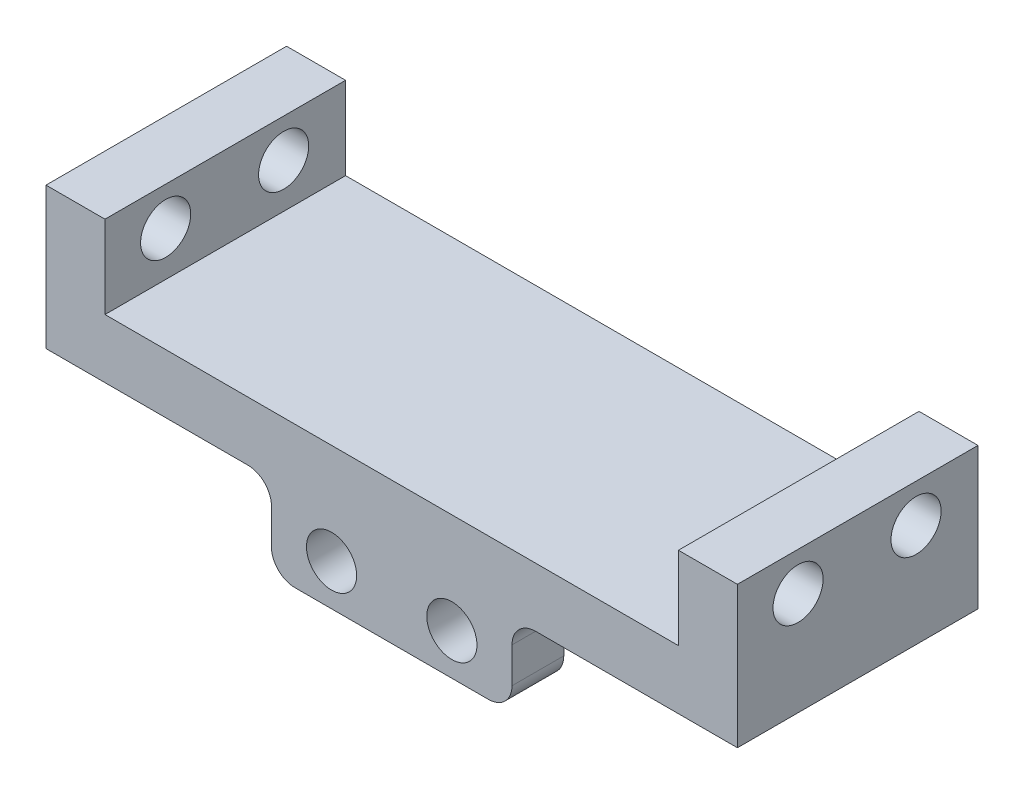
ISO-10303-21;
HEADER;
FILE_DESCRIPTION(('STEP AP214'),'2;1');
FILE_NAME('part.step','',(''),(''),'','','');
FILE_SCHEMA(('AUTOMOTIVE_DESIGN { 1 0 10303 214 1 1 1 1 }'));
ENDSEC;
DATA;
#1=APPLICATION_CONTEXT('core data for automotive mechanical design processes');
#2=APPLICATION_PROTOCOL_DEFINITION('international standard','automotive_design',2000,#1);
#3=PRODUCT_CONTEXT('',#1,'mechanical');
#4=PRODUCT('Part','Part','',(#3));
#5=PRODUCT_RELATED_PRODUCT_CATEGORY('part','',(#4));
#6=PRODUCT_DEFINITION_FORMATION('','',#4);
#7=PRODUCT_DEFINITION_CONTEXT('part definition',#1,'design');
#8=PRODUCT_DEFINITION('design','',#6,#7);
#9=PRODUCT_DEFINITION_SHAPE('','',#8);
#10=(LENGTH_UNIT() NAMED_UNIT(*) SI_UNIT(.MILLI.,.METRE.));
#11=(NAMED_UNIT(*) PLANE_ANGLE_UNIT() SI_UNIT($,.RADIAN.));
#12=(NAMED_UNIT(*) SI_UNIT($,.STERADIAN.) SOLID_ANGLE_UNIT());
#13=UNCERTAINTY_MEASURE_WITH_UNIT(LENGTH_MEASURE(1.E-05),#10,'distance_accuracy_value','');
#14=(GEOMETRIC_REPRESENTATION_CONTEXT(3) GLOBAL_UNCERTAINTY_ASSIGNED_CONTEXT((#13)) GLOBAL_UNIT_ASSIGNED_CONTEXT((#10,
#11,#12)) REPRESENTATION_CONTEXT('',''));
#15=CARTESIAN_POINT('',(0.,0.,0.));
#16=DIRECTION('',(0.,0.,1.));
#17=DIRECTION('',(1.,0.,0.));
#18=AXIS2_PLACEMENT_3D('',#15,#16,#17);
#19=CARTESIAN_POINT('',(0.,5.,0.));
#20=DIRECTION('',(1.,0.,0.));
#21=DIRECTION('',(0.,0.,-1.));
#22=AXIS2_PLACEMENT_3D('',#19,#20,#21);
#23=PLANE('',#22);
#24=CARTESIAN_POINT('',(0.,8.75,-15.13979341));
#25=DIRECTION('',(1.,0.,0.));
#26=DIRECTION('',(0.,0.,-1.));
#27=AXIS2_PLACEMENT_3D('',#24,#25,#26);
#28=CIRCLE('',#27,2.125);
#29=CARTESIAN_POINT('',(0.,8.75,-17.26479341));
#30=VERTEX_POINT('',#29);
#31=EDGE_CURVE('E195',#30,#30,#28,.T.);
#32=ORIENTED_EDGE('',*,*,#31,.T.);
#33=EDGE_LOOP('',(#32));
#34=FACE_BOUND('',#33,.T.);
#35=CARTESIAN_POINT('',(0.,8.75,-5.13979341));
#36=DIRECTION('',(1.,0.,0.));
#37=DIRECTION('',(0.,0.,-1.));
#38=AXIS2_PLACEMENT_3D('',#35,#36,#37);
#39=CIRCLE('',#38,2.125);
#40=CARTESIAN_POINT('',(0.,8.75,-7.26479341));
#41=VERTEX_POINT('',#40);
#42=EDGE_CURVE('E204',#41,#41,#39,.T.);
#43=ORIENTED_EDGE('',*,*,#42,.T.);
#44=EDGE_LOOP('',(#43));
#45=FACE_BOUND('',#44,.T.);
#46=DIRECTION('',(0.,0.,1.));
#47=VECTOR('',#46,1.);
#48=CARTESIAN_POINT('',(0.,0.,0.));
#49=LINE('',#48,#47);
#50=CARTESIAN_POINT('',(0.,0.,-20.38979341));
#51=VERTEX_POINT('',#50);
#52=CARTESIAN_POINT('',(0.,0.,0.));
#53=VERTEX_POINT('',#52);
#54=EDGE_CURVE('E235',#51,#53,#49,.T.);
#55=ORIENTED_EDGE('',*,*,#54,.T.);
#56=DIRECTION('',(0.,-1.,0.));
#57=VECTOR('',#56,1.);
#58=CARTESIAN_POINT('',(0.,5.,0.));
#59=LINE('',#58,#57);
#60=CARTESIAN_POINT('',(0.,12.,0.));
#61=VERTEX_POINT('',#60);
#62=EDGE_CURVE('E266',#61,#53,#59,.T.);
#63=ORIENTED_EDGE('',*,*,#62,.F.);
#64=DIRECTION('',(0.,0.,-1.));
#65=VECTOR('',#64,1.);
#66=CARTESIAN_POINT('',(0.,12.,-20.38979341));
#67=LINE('',#66,#65);
#68=CARTESIAN_POINT('',(0.,12.,-20.38979341));
#69=VERTEX_POINT('',#68);
#70=EDGE_CURVE('E199',#61,#69,#67,.T.);
#71=ORIENTED_EDGE('',*,*,#70,.T.);
#72=DIRECTION('',(0.,-1.,0.));
#73=VECTOR('',#72,1.);
#74=CARTESIAN_POINT('',(0.,5.,-20.38979341));
#75=LINE('',#74,#73);
#76=EDGE_CURVE('E242',#69,#51,#75,.T.);
#77=ORIENTED_EDGE('',*,*,#76,.T.);
#78=EDGE_LOOP('',(#55,#63,#71,#77));
#79=FACE_BOUND('',#78,.T.);
#80=ADVANCED_FACE('F39',(#34,#45,#79),#23,.F.);
#81=CARTESIAN_POINT('',(0.,5.,0.));
#82=DIRECTION('',(0.,0.,-1.));
#83=DIRECTION('',(-1.,0.,0.));
#84=AXIS2_PLACEMENT_3D('',#81,#82,#83);
#85=PLANE('',#84);
#86=CARTESIAN_POINT('',(34.3974483525,-3.49999999999999,0.));
#87=DIRECTION('',(0.,0.,1.));
#88=DIRECTION('',(1.,0.,0.));
#89=AXIS2_PLACEMENT_3D('',#86,#87,#88);
#90=CIRCLE('',#89,2.125);
#91=CARTESIAN_POINT('',(36.5224483525,-3.49999999999999,0.));
#92=VERTEX_POINT('',#91);
#93=EDGE_CURVE('E276',#92,#92,#90,.T.);
#94=ORIENTED_EDGE('',*,*,#93,.F.);
#95=EDGE_LOOP('',(#94));
#96=FACE_BOUND('',#95,.T.);
#97=CARTESIAN_POINT('',(24.2025516475,-3.49999999999999,0.));
#98=DIRECTION('',(0.,0.,1.));
#99=DIRECTION('',(-1.,0.,0.));
#100=AXIS2_PLACEMENT_3D('',#97,#98,#99);
#101=CIRCLE('',#100,2.125);
#102=CARTESIAN_POINT('',(22.0775516475,-3.49999999999999,0.));
#103=VERTEX_POINT('',#102);
#104=EDGE_CURVE('E429',#103,#103,#101,.T.);
#105=ORIENTED_EDGE('',*,*,#104,.F.);
#106=EDGE_LOOP('',(#105));
#107=FACE_BOUND('',#106,.T.);
#108=DIRECTION('',(0.,-1.,0.));
#109=VECTOR('',#108,1.);
#110=CARTESIAN_POINT('',(19.105103295,0.,0.));
#111=LINE('',#110,#109);
#112=CARTESIAN_POINT('',(19.105103295,-2.,0.));
#113=VERTEX_POINT('',#112);
#114=CARTESIAN_POINT('',(19.105103295,-5.,0.));
#115=VERTEX_POINT('',#114);
#116=EDGE_CURVE('E329',#113,#115,#111,.T.);
#117=ORIENTED_EDGE('',*,*,#116,.T.);
#118=CARTESIAN_POINT('',(21.105103295,-5.,0.));
#119=DIRECTION('',(0.,0.,-1.));
#120=DIRECTION('',(-1.,0.,0.));
#121=AXIS2_PLACEMENT_3D('',#118,#119,#120);
#122=CIRCLE('',#121,2.);
#123=CARTESIAN_POINT('',(21.105103295,-7.,0.));
#124=VERTEX_POINT('',#123);
#125=EDGE_CURVE('E290',#115,#124,#122,.F.);
#126=ORIENTED_EDGE('',*,*,#125,.T.);
#127=DIRECTION('',(1.,0.,0.));
#128=VECTOR('',#127,1.);
#129=CARTESIAN_POINT('',(39.494896705,-6.99999999999999,0.));
#130=LINE('',#129,#128);
#131=CARTESIAN_POINT('',(37.494896705,-6.99999999999999,0.));
#132=VERTEX_POINT('',#131);
#133=EDGE_CURVE('E339',#124,#132,#130,.T.);
#134=ORIENTED_EDGE('',*,*,#133,.T.);
#135=CARTESIAN_POINT('',(37.494896705,-4.99999999999999,0.));
#136=DIRECTION('',(0.,0.,-1.));
#137=DIRECTION('',(-1.,0.,0.));
#138=AXIS2_PLACEMENT_3D('',#135,#136,#137);
#139=CIRCLE('',#138,2.);
#140=CARTESIAN_POINT('',(39.494896705,-4.99999999999999,0.));
#141=VERTEX_POINT('',#140);
#142=EDGE_CURVE('E287',#132,#141,#139,.F.);
#143=ORIENTED_EDGE('',*,*,#142,.T.);
#144=DIRECTION('',(0.,1.,0.));
#145=VECTOR('',#144,1.);
#146=CARTESIAN_POINT('',(39.494896705,0.,0.));
#147=LINE('',#146,#145);
#148=CARTESIAN_POINT('',(39.494896705,-2.,0.));
#149=VERTEX_POINT('',#148);
#150=EDGE_CURVE('E280',#141,#149,#147,.T.);
#151=ORIENTED_EDGE('',*,*,#150,.T.);
#152=CARTESIAN_POINT('',(41.494896705,-2.,0.));
#153=DIRECTION('',(0.,0.,-1.));
#154=DIRECTION('',(-1.,0.,0.));
#155=AXIS2_PLACEMENT_3D('',#152,#153,#154);
#156=CIRCLE('',#155,2.);
#157=CARTESIAN_POINT('',(41.494896705,0.,0.));
#158=VERTEX_POINT('',#157);
#159=EDGE_CURVE('E319',#149,#158,#156,.T.);
#160=ORIENTED_EDGE('',*,*,#159,.T.);
#161=DIRECTION('',(1.,0.,0.));
#162=VECTOR('',#161,1.);
#163=CARTESIAN_POINT('',(0.,0.,0.));
#164=LINE('',#163,#162);
#165=CARTESIAN_POINT('',(58.6,0.,0.));
#166=VERTEX_POINT('',#165);
#167=EDGE_CURVE('E246',#158,#166,#164,.T.);
#168=ORIENTED_EDGE('',*,*,#167,.T.);
#169=DIRECTION('',(0.,-1.,0.));
#170=VECTOR('',#169,1.);
#171=CARTESIAN_POINT('',(58.6,5.,0.));
#172=LINE('',#171,#170);
#173=CARTESIAN_POINT('',(58.6,12.,0.));
#174=VERTEX_POINT('',#173);
#175=EDGE_CURVE('E262',#174,#166,#172,.T.);
#176=ORIENTED_EDGE('',*,*,#175,.F.);
#177=DIRECTION('',(1.,0.,0.));
#178=VECTOR('',#177,1.);
#179=CARTESIAN_POINT('',(53.6,12.,0.));
#180=LINE('',#179,#178);
#181=CARTESIAN_POINT('',(53.6,12.,0.));
#182=VERTEX_POINT('',#181);
#183=EDGE_CURVE('E172',#182,#174,#180,.T.);
#184=ORIENTED_EDGE('',*,*,#183,.F.);
#185=DIRECTION('',(0.,1.,0.));
#186=VECTOR('',#185,1.);
#187=CARTESIAN_POINT('',(53.6,0.,0.));
#188=LINE('',#187,#186);
#189=CARTESIAN_POINT('',(53.6,5.,0.));
#190=VERTEX_POINT('',#189);
#191=EDGE_CURVE('E157',#190,#182,#188,.T.);
#192=ORIENTED_EDGE('',*,*,#191,.F.);
#193=DIRECTION('',(1.,0.,0.));
#194=VECTOR('',#193,1.);
#195=CARTESIAN_POINT('',(0.,5.,0.));
#196=LINE('',#195,#194);
#197=CARTESIAN_POINT('',(5.,5.,0.));
#198=VERTEX_POINT('',#197);
#199=EDGE_CURVE('E236',#198,#190,#196,.T.);
#200=ORIENTED_EDGE('',*,*,#199,.F.);
#201=DIRECTION('',(0.,1.,0.));
#202=VECTOR('',#201,1.);
#203=CARTESIAN_POINT('',(5.,0.,0.));
#204=LINE('',#203,#202);
#205=CARTESIAN_POINT('',(5.,12.,0.));
#206=VERTEX_POINT('',#205);
#207=EDGE_CURVE('E214',#198,#206,#204,.T.);
#208=ORIENTED_EDGE('',*,*,#207,.T.);
#209=DIRECTION('',(-1.,0.,0.));
#210=VECTOR('',#209,1.);
#211=CARTESIAN_POINT('',(5.,12.,0.));
#212=LINE('',#211,#210);
#213=EDGE_CURVE('E221',#206,#61,#212,.T.);
#214=ORIENTED_EDGE('',*,*,#213,.T.);
#215=ORIENTED_EDGE('',*,*,#62,.T.);
#216=CARTESIAN_POINT('',(17.105103295,0.,0.));
#217=VERTEX_POINT('',#216);
#218=EDGE_CURVE('E247',#53,#217,#164,.T.);
#219=ORIENTED_EDGE('',*,*,#218,.T.);
#220=CARTESIAN_POINT('',(17.105103295,-2.,0.));
#221=DIRECTION('',(0.,0.,-1.));
#222=DIRECTION('',(-1.,0.,0.));
#223=AXIS2_PLACEMENT_3D('',#220,#221,#222);
#224=CIRCLE('',#223,2.);
#225=EDGE_CURVE('E48',#217,#113,#224,.T.);
#226=ORIENTED_EDGE('',*,*,#225,.T.);
#227=EDGE_LOOP('',(#117,#126,#134,#143,#151,#160,#168,#176,#184,#192,#200,#208,#214,#215,#219,#226));
#228=FACE_BOUND('',#227,.T.);
#229=ADVANCED_FACE('F328',(#96,#107,#228),#85,.F.);
#230=CARTESIAN_POINT('',(58.6,5.,0.));
#231=DIRECTION('',(-1.,0.,0.));
#232=DIRECTION('',(0.,0.,1.));
#233=AXIS2_PLACEMENT_3D('',#230,#231,#232);
#234=PLANE('',#233);
#235=CARTESIAN_POINT('',(58.6,8.75,-15.13979341));
#236=DIRECTION('',(1.,0.,0.));
#237=DIRECTION('',(0.,0.,-1.));
#238=AXIS2_PLACEMENT_3D('',#235,#236,#237);
#239=CIRCLE('',#238,2.125);
#240=CARTESIAN_POINT('',(58.6,8.75,-17.26479341));
#241=VERTEX_POINT('',#240);
#242=EDGE_CURVE('E181',#241,#241,#239,.T.);
#243=ORIENTED_EDGE('',*,*,#242,.F.);
#244=EDGE_LOOP('',(#243));
#245=FACE_BOUND('',#244,.T.);
#246=CARTESIAN_POINT('',(58.6,8.75,-5.13979341));
#247=DIRECTION('',(1.,0.,0.));
#248=DIRECTION('',(0.,0.,-1.));
#249=AXIS2_PLACEMENT_3D('',#246,#247,#248);
#250=CIRCLE('',#249,2.125);
#251=CARTESIAN_POINT('',(58.6,8.75,-7.26479341));
#252=VERTEX_POINT('',#251);
#253=EDGE_CURVE('E369',#252,#252,#250,.T.);
#254=ORIENTED_EDGE('',*,*,#253,.F.);
#255=EDGE_LOOP('',(#254));
#256=FACE_BOUND('',#255,.T.);
#257=DIRECTION('',(0.,0.,-1.));
#258=VECTOR('',#257,1.);
#259=CARTESIAN_POINT('',(58.6,0.,0.));
#260=LINE('',#259,#258);
#261=CARTESIAN_POINT('',(58.6,0.,-20.38979341));
#262=VERTEX_POINT('',#261);
#263=EDGE_CURVE('E251',#166,#262,#260,.T.);
#264=ORIENTED_EDGE('',*,*,#263,.T.);
#265=DIRECTION('',(0.,-1.,0.));
#266=VECTOR('',#265,1.);
#267=CARTESIAN_POINT('',(58.6,5.,-20.38979341));
#268=LINE('',#267,#266);
#269=CARTESIAN_POINT('',(58.6,12.,-20.38979341));
#270=VERTEX_POINT('',#269);
#271=EDGE_CURVE('E259',#270,#262,#268,.T.);
#272=ORIENTED_EDGE('',*,*,#271,.F.);
#273=DIRECTION('',(0.,0.,-1.));
#274=VECTOR('',#273,1.);
#275=CARTESIAN_POINT('',(58.6,12.,-20.38979341));
#276=LINE('',#275,#274);
#277=EDGE_CURVE('E168',#174,#270,#276,.T.);
#278=ORIENTED_EDGE('',*,*,#277,.F.);
#279=ORIENTED_EDGE('',*,*,#175,.T.);
#280=EDGE_LOOP('',(#264,#272,#278,#279));
#281=FACE_BOUND('',#280,.T.);
#282=ADVANCED_FACE('F398',(#245,#256,#281),#234,.F.);
#283=CARTESIAN_POINT('',(0.,5.,-20.38979341));
#284=DIRECTION('',(0.,0.,1.));
#285=DIRECTION('',(1.,0.,0.));
#286=AXIS2_PLACEMENT_3D('',#283,#284,#285);
#287=PLANE('',#286);
#288=DIRECTION('',(-1.,0.,0.));
#289=VECTOR('',#288,1.);
#290=CARTESIAN_POINT('',(0.,5.,-20.38979341));
#291=LINE('',#290,#289);
#292=CARTESIAN_POINT('',(53.6,5.,-20.38979341));
#293=VERTEX_POINT('',#292);
#294=CARTESIAN_POINT('',(5.,5.,-20.38979341));
#295=VERTEX_POINT('',#294);
#296=EDGE_CURVE('E177',#293,#295,#291,.T.);
#297=ORIENTED_EDGE('',*,*,#296,.F.);
#298=DIRECTION('',(0.,-1.,0.));
#299=VECTOR('',#298,1.);
#300=CARTESIAN_POINT('',(53.6,0.,-20.38979341));
#301=LINE('',#300,#299);
#302=CARTESIAN_POINT('',(53.6,12.,-20.38979341));
#303=VERTEX_POINT('',#302);
#304=EDGE_CURVE('E155',#303,#293,#301,.T.);
#305=ORIENTED_EDGE('',*,*,#304,.F.);
#306=DIRECTION('',(1.,0.,0.));
#307=VECTOR('',#306,1.);
#308=CARTESIAN_POINT('',(53.6,12.,-20.38979341));
#309=LINE('',#308,#307);
#310=EDGE_CURVE('E165',#303,#270,#309,.T.);
#311=ORIENTED_EDGE('',*,*,#310,.T.);
#312=ORIENTED_EDGE('',*,*,#271,.T.);
#313=DIRECTION('',(-1.,0.,0.));
#314=VECTOR('',#313,1.);
#315=CARTESIAN_POINT('',(0.,0.,-20.38979341));
#316=LINE('',#315,#314);
#317=EDGE_CURVE('E239',#262,#51,#316,.T.);
#318=ORIENTED_EDGE('',*,*,#317,.T.);
#319=ORIENTED_EDGE('',*,*,#76,.F.);
#320=DIRECTION('',(-1.,0.,0.));
#321=VECTOR('',#320,1.);
#322=CARTESIAN_POINT('',(5.,12.,-20.38979341));
#323=LINE('',#322,#321);
#324=CARTESIAN_POINT('',(5.,12.,-20.38979341));
#325=VERTEX_POINT('',#324);
#326=EDGE_CURVE('E225',#325,#69,#323,.T.);
#327=ORIENTED_EDGE('',*,*,#326,.F.);
#328=DIRECTION('',(0.,-1.,0.));
#329=VECTOR('',#328,1.);
#330=CARTESIAN_POINT('',(5.,0.,-20.38979341));
#331=LINE('',#330,#329);
#332=EDGE_CURVE('E211',#325,#295,#331,.T.);
#333=ORIENTED_EDGE('',*,*,#332,.T.);
#334=EDGE_LOOP('',(#297,#305,#311,#312,#318,#319,#327,#333));
#335=FACE_BOUND('',#334,.T.);
#336=ADVANCED_FACE('F175',(#335),#287,.F.);
#337=CARTESIAN_POINT('',(0.,5.,0.));
#338=DIRECTION('',(0.,-1.,0.));
#339=DIRECTION('',(0.,0.,-1.));
#340=AXIS2_PLACEMENT_3D('',#337,#338,#339);
#341=PLANE('',#340);
#342=ORIENTED_EDGE('',*,*,#199,.T.);
#343=DIRECTION('',(0.,0.,-1.));
#344=VECTOR('',#343,1.);
#345=CARTESIAN_POINT('',(53.6,5.,0.));
#346=LINE('',#345,#344);
#347=EDGE_CURVE('E190',#190,#293,#346,.T.);
#348=ORIENTED_EDGE('',*,*,#347,.T.);
#349=ORIENTED_EDGE('',*,*,#296,.T.);
#350=DIRECTION('',(0.,0.,1.));
#351=VECTOR('',#350,1.);
#352=CARTESIAN_POINT('',(5.,5.,0.));
#353=LINE('',#352,#351);
#354=EDGE_CURVE('E229',#295,#198,#353,.T.);
#355=ORIENTED_EDGE('',*,*,#354,.T.);
#356=EDGE_LOOP('',(#342,#348,#349,#355));
#357=FACE_BOUND('',#356,.T.);
#358=ADVANCED_FACE('F525',(#357),#341,.F.);
#359=CARTESIAN_POINT('',(0.,0.,0.));
#360=DIRECTION('',(0.,-1.,0.));
#361=DIRECTION('',(0.,0.,-1.));
#362=AXIS2_PLACEMENT_3D('',#359,#360,#361);
#363=PLANE('',#362);
#364=ORIENTED_EDGE('',*,*,#167,.F.);
#365=DIRECTION('',(0.,0.,1.));
#366=VECTOR('',#365,1.);
#367=CARTESIAN_POINT('',(41.494896705,0.,-4.38979341));
#368=LINE('',#367,#366);
#369=CARTESIAN_POINT('',(41.494896705,0.,-4.38979341));
#370=VERTEX_POINT('',#369);
#371=EDGE_CURVE('E316',#158,#370,#368,.F.);
#372=ORIENTED_EDGE('',*,*,#371,.T.);
#373=DIRECTION('',(-1.,0.,0.));
#374=VECTOR('',#373,1.);
#375=CARTESIAN_POINT('',(39.494896705,0.,-4.38979341));
#376=LINE('',#375,#374);
#377=CARTESIAN_POINT('',(17.105103295,0.,-4.38979341));
#378=VERTEX_POINT('',#377);
#379=EDGE_CURVE('E54',#370,#378,#376,.T.);
#380=ORIENTED_EDGE('',*,*,#379,.T.);
#381=DIRECTION('',(0.,0.,1.));
#382=VECTOR('',#381,1.);
#383=CARTESIAN_POINT('',(17.105103295,0.,0.));
#384=LINE('',#383,#382);
#385=EDGE_CURVE('E313',#378,#217,#384,.T.);
#386=ORIENTED_EDGE('',*,*,#385,.T.);
#387=ORIENTED_EDGE('',*,*,#218,.F.);
#388=ORIENTED_EDGE('',*,*,#54,.F.);
#389=ORIENTED_EDGE('',*,*,#317,.F.);
#390=ORIENTED_EDGE('',*,*,#263,.F.);
#391=EDGE_LOOP('',(#364,#372,#380,#386,#387,#388,#389,#390));
#392=FACE_BOUND('',#391,.T.);
#393=ADVANCED_FACE('F520',(#392),#363,.T.);
#394=CARTESIAN_POINT('',(5.,0.,0.));
#395=DIRECTION('',(1.,0.,0.));
#396=DIRECTION('',(0.,0.,-1.));
#397=AXIS2_PLACEMENT_3D('',#394,#395,#396);
#398=PLANE('',#397);
#399=CARTESIAN_POINT('',(5.,8.75,-15.13979341));
#400=DIRECTION('',(1.,0.,0.));
#401=DIRECTION('',(0.,0.,-1.));
#402=AXIS2_PLACEMENT_3D('',#399,#400,#401);
#403=CIRCLE('',#402,2.125);
#404=CARTESIAN_POINT('',(5.,8.75,-17.26479341));
#405=VERTEX_POINT('',#404);
#406=EDGE_CURVE('E200',#405,#405,#403,.T.);
#407=ORIENTED_EDGE('',*,*,#406,.F.);
#408=EDGE_LOOP('',(#407));
#409=FACE_BOUND('',#408,.T.);
#410=CARTESIAN_POINT('',(5.,8.75,-5.13979341));
#411=DIRECTION('',(1.,0.,0.));
#412=DIRECTION('',(0.,0.,-1.));
#413=AXIS2_PLACEMENT_3D('',#410,#411,#412);
#414=CIRCLE('',#413,2.125);
#415=CARTESIAN_POINT('',(5.,8.75,-7.26479341));
#416=VERTEX_POINT('',#415);
#417=EDGE_CURVE('E194',#416,#416,#414,.T.);
#418=ORIENTED_EDGE('',*,*,#417,.F.);
#419=EDGE_LOOP('',(#418));
#420=FACE_BOUND('',#419,.T.);
#421=ORIENTED_EDGE('',*,*,#354,.F.);
#422=ORIENTED_EDGE('',*,*,#332,.F.);
#423=DIRECTION('',(0.,0.,-1.));
#424=VECTOR('',#423,1.);
#425=CARTESIAN_POINT('',(5.,12.,-20.38979341));
#426=LINE('',#425,#424);
#427=EDGE_CURVE('E217',#206,#325,#426,.T.);
#428=ORIENTED_EDGE('',*,*,#427,.F.);
#429=ORIENTED_EDGE('',*,*,#207,.F.);
#430=EDGE_LOOP('',(#421,#422,#428,#429));
#431=FACE_BOUND('',#430,.T.);
#432=ADVANCED_FACE('F524',(#409,#420,#431),#398,.T.);
#433=CARTESIAN_POINT('',(5.,12.,-20.38979341));
#434=DIRECTION('',(0.,1.,0.));
#435=DIRECTION('',(0.,0.,1.));
#436=AXIS2_PLACEMENT_3D('',#433,#434,#435);
#437=PLANE('',#436);
#438=ORIENTED_EDGE('',*,*,#70,.F.);
#439=ORIENTED_EDGE('',*,*,#213,.F.);
#440=ORIENTED_EDGE('',*,*,#427,.T.);
#441=ORIENTED_EDGE('',*,*,#326,.T.);
#442=EDGE_LOOP('',(#438,#439,#440,#441));
#443=FACE_BOUND('',#442,.T.);
#444=ADVANCED_FACE('F540',(#443),#437,.T.);
#445=CARTESIAN_POINT('',(0.,8.75,-5.13979341));
#446=DIRECTION('',(1.,0.,0.));
#447=DIRECTION('',(0.,0.,-1.));
#448=AXIS2_PLACEMENT_3D('',#445,#446,#447);
#449=CYLINDRICAL_SURFACE('',#448,2.125);
#450=ORIENTED_EDGE('',*,*,#42,.F.);
#451=EDGE_LOOP('',(#450));
#452=FACE_BOUND('',#451,.T.);
#453=ORIENTED_EDGE('',*,*,#417,.T.);
#454=EDGE_LOOP('',(#453));
#455=FACE_BOUND('',#454,.T.);
#456=ADVANCED_FACE('F549',(#452,#455),#449,.F.);
#457=CARTESIAN_POINT('',(0.,8.75,-15.13979341));
#458=DIRECTION('',(1.,0.,0.));
#459=DIRECTION('',(0.,0.,-1.));
#460=AXIS2_PLACEMENT_3D('',#457,#458,#459);
#461=CYLINDRICAL_SURFACE('',#460,2.125);
#462=ORIENTED_EDGE('',*,*,#31,.F.);
#463=EDGE_LOOP('',(#462));
#464=FACE_BOUND('',#463,.T.);
#465=ORIENTED_EDGE('',*,*,#406,.T.);
#466=EDGE_LOOP('',(#465));
#467=FACE_BOUND('',#466,.T.);
#468=ADVANCED_FACE('F556',(#464,#467),#461,.F.);
#469=CARTESIAN_POINT('',(53.6,0.,0.));
#470=DIRECTION('',(-1.,0.,0.));
#471=DIRECTION('',(0.,0.,-1.));
#472=AXIS2_PLACEMENT_3D('',#469,#470,#471);
#473=PLANE('',#472);
#474=CARTESIAN_POINT('',(53.6,8.75,-15.13979341));
#475=DIRECTION('',(1.,0.,0.));
#476=DIRECTION('',(0.,0.,-1.));
#477=AXIS2_PLACEMENT_3D('',#474,#475,#476);
#478=CIRCLE('',#477,2.125);
#479=CARTESIAN_POINT('',(53.6,8.75,-17.26479341));
#480=VERTEX_POINT('',#479);
#481=EDGE_CURVE('E366',#480,#480,#478,.T.);
#482=ORIENTED_EDGE('',*,*,#481,.T.);
#483=EDGE_LOOP('',(#482));
#484=FACE_BOUND('',#483,.T.);
#485=CARTESIAN_POINT('',(53.6,8.75,-5.13979341));
#486=DIRECTION('',(1.,0.,0.));
#487=DIRECTION('',(0.,0.,-1.));
#488=AXIS2_PLACEMENT_3D('',#485,#486,#487);
#489=CIRCLE('',#488,2.125);
#490=CARTESIAN_POINT('',(53.6,8.75,-7.26479341));
#491=VERTEX_POINT('',#490);
#492=EDGE_CURVE('E184',#491,#491,#489,.T.);
#493=ORIENTED_EDGE('',*,*,#492,.T.);
#494=EDGE_LOOP('',(#493));
#495=FACE_BOUND('',#494,.T.);
#496=ORIENTED_EDGE('',*,*,#347,.F.);
#497=ORIENTED_EDGE('',*,*,#191,.T.);
#498=DIRECTION('',(0.,0.,-1.));
#499=VECTOR('',#498,1.);
#500=CARTESIAN_POINT('',(53.6,12.,-20.38979341));
#501=LINE('',#500,#499);
#502=EDGE_CURVE('E150',#182,#303,#501,.T.);
#503=ORIENTED_EDGE('',*,*,#502,.T.);
#504=ORIENTED_EDGE('',*,*,#304,.T.);
#505=EDGE_LOOP('',(#496,#497,#503,#504));
#506=FACE_BOUND('',#505,.T.);
#507=ADVANCED_FACE('F153',(#484,#495,#506),#473,.T.);
#508=CARTESIAN_POINT('',(53.6,12.,-20.38979341));
#509=DIRECTION('',(0.,-1.,0.));
#510=DIRECTION('',(0.,0.,-1.));
#511=AXIS2_PLACEMENT_3D('',#508,#509,#510);
#512=PLANE('',#511);
#513=ORIENTED_EDGE('',*,*,#277,.T.);
#514=ORIENTED_EDGE('',*,*,#310,.F.);
#515=ORIENTED_EDGE('',*,*,#502,.F.);
#516=ORIENTED_EDGE('',*,*,#183,.T.);
#517=EDGE_LOOP('',(#513,#514,#515,#516));
#518=FACE_BOUND('',#517,.T.);
#519=ADVANCED_FACE('F166',(#518),#512,.F.);
#520=CARTESIAN_POINT('',(58.6,8.75,-5.13979341));
#521=DIRECTION('',(-1.,0.,0.));
#522=DIRECTION('',(0.,0.,1.));
#523=AXIS2_PLACEMENT_3D('',#520,#521,#522);
#524=CYLINDRICAL_SURFACE('',#523,2.125);
#525=ORIENTED_EDGE('',*,*,#253,.T.);
#526=EDGE_LOOP('',(#525));
#527=FACE_BOUND('',#526,.T.);
#528=ORIENTED_EDGE('',*,*,#492,.F.);
#529=EDGE_LOOP('',(#528));
#530=FACE_BOUND('',#529,.T.);
#531=ADVANCED_FACE('F379',(#527,#530),#524,.F.);
#532=CARTESIAN_POINT('',(58.6,8.75,-15.13979341));
#533=DIRECTION('',(-1.,0.,0.));
#534=DIRECTION('',(0.,0.,1.));
#535=AXIS2_PLACEMENT_3D('',#532,#533,#534);
#536=CYLINDRICAL_SURFACE('',#535,2.125);
#537=ORIENTED_EDGE('',*,*,#242,.T.);
#538=EDGE_LOOP('',(#537));
#539=FACE_BOUND('',#538,.T.);
#540=ORIENTED_EDGE('',*,*,#481,.F.);
#541=EDGE_LOOP('',(#540));
#542=FACE_BOUND('',#541,.T.);
#543=ADVANCED_FACE('F381',(#539,#542),#536,.F.);
#544=CARTESIAN_POINT('',(39.494896705,0.,-4.38979341));
#545=DIRECTION('',(1.,0.,0.));
#546=DIRECTION('',(0.,0.,-1.));
#547=AXIS2_PLACEMENT_3D('',#544,#545,#546);
#548=PLANE('',#547);
#549=ORIENTED_EDGE('',*,*,#150,.F.);
#550=DIRECTION('',(0.,0.,1.));
#551=VECTOR('',#550,1.);
#552=CARTESIAN_POINT('',(39.494896705,-4.99999999999999,-4.38979341));
#553=LINE('',#552,#551);
#554=CARTESIAN_POINT('',(39.494896705,-4.99999999999999,-4.38979341));
#555=VERTEX_POINT('',#554);
#556=EDGE_CURVE('E310',#141,#555,#553,.F.);
#557=ORIENTED_EDGE('',*,*,#556,.T.);
#558=DIRECTION('',(0.,1.,0.));
#559=VECTOR('',#558,1.);
#560=CARTESIAN_POINT('',(39.494896705,0.,-4.38979341));
#561=LINE('',#560,#559);
#562=CARTESIAN_POINT('',(39.494896705,-2.,-4.38979341));
#563=VERTEX_POINT('',#562);
#564=EDGE_CURVE('E353',#555,#563,#561,.T.);
#565=ORIENTED_EDGE('',*,*,#564,.T.);
#566=DIRECTION('',(0.,0.,1.));
#567=VECTOR('',#566,1.);
#568=CARTESIAN_POINT('',(39.494896705,-2.,0.));
#569=LINE('',#568,#567);
#570=EDGE_CURVE('E306',#563,#149,#569,.T.);
#571=ORIENTED_EDGE('',*,*,#570,.T.);
#572=EDGE_LOOP('',(#549,#557,#565,#571));
#573=FACE_BOUND('',#572,.T.);
#574=ADVANCED_FACE('F387',(#573),#548,.T.);
#575=CARTESIAN_POINT('',(39.494896705,-6.99999999999999,-4.38979341));
#576=DIRECTION('',(0.,-1.,0.));
#577=DIRECTION('',(1.,0.,0.));
#578=AXIS2_PLACEMENT_3D('',#575,#576,#577);
#579=PLANE('',#578);
#580=ORIENTED_EDGE('',*,*,#133,.F.);
#581=DIRECTION('',(0.,0.,1.));
#582=VECTOR('',#581,1.);
#583=CARTESIAN_POINT('',(21.105103295,-7.,-4.38979341));
#584=LINE('',#583,#582);
#585=CARTESIAN_POINT('',(21.105103295,-7.,-4.38979341));
#586=VERTEX_POINT('',#585);
#587=EDGE_CURVE('E297',#124,#586,#584,.F.);
#588=ORIENTED_EDGE('',*,*,#587,.T.);
#589=DIRECTION('',(1.,0.,0.));
#590=VECTOR('',#589,1.);
#591=CARTESIAN_POINT('',(39.494896705,-6.99999999999999,-4.38979341));
#592=LINE('',#591,#590);
#593=CARTESIAN_POINT('',(37.494896705,-6.99999999999999,-4.38979341));
#594=VERTEX_POINT('',#593);
#595=EDGE_CURVE('E347',#586,#594,#592,.T.);
#596=ORIENTED_EDGE('',*,*,#595,.T.);
#597=DIRECTION('',(0.,0.,1.));
#598=VECTOR('',#597,1.);
#599=CARTESIAN_POINT('',(37.494896705,-6.99999999999999,-4.38979341));
#600=LINE('',#599,#598);
#601=EDGE_CURVE('E293',#594,#132,#600,.T.);
#602=ORIENTED_EDGE('',*,*,#601,.T.);
#603=EDGE_LOOP('',(#580,#588,#596,#602));
#604=FACE_BOUND('',#603,.T.);
#605=ADVANCED_FACE('F453',(#604),#579,.T.);
#606=CARTESIAN_POINT('',(19.105103295,0.,-4.38979341));
#607=DIRECTION('',(-1.,0.,0.));
#608=DIRECTION('',(0.,-1.,0.));
#609=AXIS2_PLACEMENT_3D('',#606,#607,#608);
#610=PLANE('',#609);
#611=DIRECTION('',(0.,-1.,0.));
#612=VECTOR('',#611,1.);
#613=CARTESIAN_POINT('',(19.105103295,0.,-4.38979341));
#614=LINE('',#613,#612);
#615=CARTESIAN_POINT('',(19.105103295,-2.,-4.38979341));
#616=VERTEX_POINT('',#615);
#617=CARTESIAN_POINT('',(19.105103295,-5.,-4.38979341));
#618=VERTEX_POINT('',#617);
#619=EDGE_CURVE('E344',#616,#618,#614,.T.);
#620=ORIENTED_EDGE('',*,*,#619,.T.);
#621=DIRECTION('',(0.,0.,1.));
#622=VECTOR('',#621,1.);
#623=CARTESIAN_POINT('',(19.105103295,-5.,-4.38979341));
#624=LINE('',#623,#622);
#625=EDGE_CURVE('E283',#618,#115,#624,.T.);
#626=ORIENTED_EDGE('',*,*,#625,.T.);
#627=ORIENTED_EDGE('',*,*,#116,.F.);
#628=DIRECTION('',(0.,0.,1.));
#629=VECTOR('',#628,1.);
#630=CARTESIAN_POINT('',(19.105103295,-2.,-4.38979341));
#631=LINE('',#630,#629);
#632=EDGE_CURVE('E270',#113,#616,#631,.F.);
#633=ORIENTED_EDGE('',*,*,#632,.T.);
#634=EDGE_LOOP('',(#620,#626,#627,#633));
#635=FACE_BOUND('',#634,.T.);
#636=ADVANCED_FACE('F335',(#635),#610,.T.);
#637=CARTESIAN_POINT('',(0.,0.,-4.38979341));
#638=DIRECTION('',(0.,0.,-1.));
#639=DIRECTION('',(-1.,0.,0.));
#640=AXIS2_PLACEMENT_3D('',#637,#638,#639);
#641=PLANE('',#640);
#642=CARTESIAN_POINT('',(34.3974483525,-3.49999999999999,-4.38979341));
#643=DIRECTION('',(0.,0.,-1.));
#644=DIRECTION('',(-1.,0.,0.));
#645=AXIS2_PLACEMENT_3D('',#642,#643,#644);
#646=CIRCLE('',#645,2.125);
#647=CARTESIAN_POINT('',(32.2724483525,-3.49999999999999,-4.38979341));
#648=VERTEX_POINT('',#647);
#649=EDGE_CURVE('E275',#648,#648,#646,.T.);
#650=ORIENTED_EDGE('',*,*,#649,.F.);
#651=EDGE_LOOP('',(#650));
#652=FACE_BOUND('',#651,.T.);
#653=CARTESIAN_POINT('',(24.2025516475,-3.49999999999999,-4.38979341));
#654=DIRECTION('',(0.,0.,-1.));
#655=DIRECTION('',(-1.,0.,0.));
#656=AXIS2_PLACEMENT_3D('',#653,#654,#655);
#657=CIRCLE('',#656,2.125);
#658=CARTESIAN_POINT('',(22.0775516475,-3.49999999999999,-4.38979341));
#659=VERTEX_POINT('',#658);
#660=EDGE_CURVE('E271',#659,#659,#657,.T.);
#661=ORIENTED_EDGE('',*,*,#660,.F.);
#662=EDGE_LOOP('',(#661));
#663=FACE_BOUND('',#662,.T.);
#664=ORIENTED_EDGE('',*,*,#595,.F.);
#665=CARTESIAN_POINT('',(21.105103295,-5.,-4.38979341));
#666=DIRECTION('',(0.,0.,-1.));
#667=DIRECTION('',(-1.,0.,0.));
#668=AXIS2_PLACEMENT_3D('',#665,#666,#667);
#669=CIRCLE('',#668,2.);
#670=EDGE_CURVE('E303',#586,#618,#669,.T.);
#671=ORIENTED_EDGE('',*,*,#670,.T.);
#672=ORIENTED_EDGE('',*,*,#619,.F.);
#673=CARTESIAN_POINT('',(17.105103295,-2.,-4.38979341));
#674=DIRECTION('',(0.,0.,-1.));
#675=DIRECTION('',(-1.,0.,0.));
#676=AXIS2_PLACEMENT_3D('',#673,#674,#675);
#677=CIRCLE('',#676,2.);
#678=EDGE_CURVE('E11',#616,#378,#677,.F.);
#679=ORIENTED_EDGE('',*,*,#678,.T.);
#680=ORIENTED_EDGE('',*,*,#379,.F.);
#681=CARTESIAN_POINT('',(41.494896705,-2.,-4.38979341));
#682=DIRECTION('',(0.,0.,-1.));
#683=DIRECTION('',(-1.,0.,0.));
#684=AXIS2_PLACEMENT_3D('',#681,#682,#683);
#685=CIRCLE('',#684,2.);
#686=EDGE_CURVE('E322',#370,#563,#685,.F.);
#687=ORIENTED_EDGE('',*,*,#686,.T.);
#688=ORIENTED_EDGE('',*,*,#564,.F.);
#689=CARTESIAN_POINT('',(37.494896705,-4.99999999999999,-4.38979341));
#690=DIRECTION('',(0.,0.,-1.));
#691=DIRECTION('',(-1.,0.,0.));
#692=AXIS2_PLACEMENT_3D('',#689,#690,#691);
#693=CIRCLE('',#692,2.);
#694=EDGE_CURVE('E300',#555,#594,#693,.T.);
#695=ORIENTED_EDGE('',*,*,#694,.T.);
#696=EDGE_LOOP('',(#664,#671,#672,#679,#680,#687,#688,#695));
#697=FACE_BOUND('',#696,.T.);
#698=ADVANCED_FACE('F343',(#652,#663,#697),#641,.T.);
#699=CARTESIAN_POINT('',(24.2025516475,-3.49999999999999,-5.));
#700=DIRECTION('',(0.,0.,1.));
#701=DIRECTION('',(1.,0.,0.));
#702=AXIS2_PLACEMENT_3D('',#699,#700,#701);
#703=CYLINDRICAL_SURFACE('',#702,2.125);
#704=ORIENTED_EDGE('',*,*,#660,.T.);
#705=EDGE_LOOP('',(#704));
#706=FACE_BOUND('',#705,.T.);
#707=ORIENTED_EDGE('',*,*,#104,.T.);
#708=EDGE_LOOP('',(#707));
#709=FACE_BOUND('',#708,.T.);
#710=ADVANCED_FACE('F440',(#706,#709),#703,.F.);
#711=CARTESIAN_POINT('',(34.3974483525,-3.49999999999999,-5.));
#712=DIRECTION('',(0.,0.,1.));
#713=DIRECTION('',(1.,0.,0.));
#714=AXIS2_PLACEMENT_3D('',#711,#712,#713);
#715=CYLINDRICAL_SURFACE('',#714,2.125);
#716=ORIENTED_EDGE('',*,*,#649,.T.);
#717=EDGE_LOOP('',(#716));
#718=FACE_BOUND('',#717,.T.);
#719=ORIENTED_EDGE('',*,*,#93,.T.);
#720=EDGE_LOOP('',(#719));
#721=FACE_BOUND('',#720,.T.);
#722=ADVANCED_FACE('F408',(#718,#721),#715,.F.);
#723=CARTESIAN_POINT('',(21.105103295,-5.,-4.38979341));
#724=DIRECTION('',(0.,0.,1.));
#725=DIRECTION('',(1.,0.,0.));
#726=AXIS2_PLACEMENT_3D('',#723,#724,#725);
#727=CYLINDRICAL_SURFACE('',#726,2.);
#728=ORIENTED_EDGE('',*,*,#670,.F.);
#729=ORIENTED_EDGE('',*,*,#587,.F.);
#730=ORIENTED_EDGE('',*,*,#125,.F.);
#731=ORIENTED_EDGE('',*,*,#625,.F.);
#732=EDGE_LOOP('',(#728,#729,#730,#731));
#733=FACE_BOUND('',#732,.T.);
#734=ADVANCED_FACE('F404',(#733),#727,.T.);
#735=CARTESIAN_POINT('',(37.494896705,-4.99999999999999,-4.38979341));
#736=DIRECTION('',(0.,0.,1.));
#737=DIRECTION('',(1.,0.,0.));
#738=AXIS2_PLACEMENT_3D('',#735,#736,#737);
#739=CYLINDRICAL_SURFACE('',#738,2.);
#740=ORIENTED_EDGE('',*,*,#694,.F.);
#741=ORIENTED_EDGE('',*,*,#556,.F.);
#742=ORIENTED_EDGE('',*,*,#142,.F.);
#743=ORIENTED_EDGE('',*,*,#601,.F.);
#744=EDGE_LOOP('',(#740,#741,#742,#743));
#745=FACE_BOUND('',#744,.T.);
#746=ADVANCED_FACE('F407',(#745),#739,.T.);
#747=CARTESIAN_POINT('',(41.494896705,-2.,-4.38979341));
#748=DIRECTION('',(0.,0.,-1.));
#749=DIRECTION('',(-1.,0.,0.));
#750=AXIS2_PLACEMENT_3D('',#747,#748,#749);
#751=CYLINDRICAL_SURFACE('',#750,2.);
#752=ORIENTED_EDGE('',*,*,#686,.F.);
#753=ORIENTED_EDGE('',*,*,#371,.F.);
#754=ORIENTED_EDGE('',*,*,#159,.F.);
#755=ORIENTED_EDGE('',*,*,#570,.F.);
#756=EDGE_LOOP('',(#752,#753,#754,#755));
#757=FACE_BOUND('',#756,.T.);
#758=ADVANCED_FACE('F411',(#757),#751,.F.);
#759=CARTESIAN_POINT('',(17.105103295,-2.,0.));
#760=DIRECTION('',(0.,0.,-1.));
#761=DIRECTION('',(-1.,0.,0.));
#762=AXIS2_PLACEMENT_3D('',#759,#760,#761);
#763=CYLINDRICAL_SURFACE('',#762,2.);
#764=ORIENTED_EDGE('',*,*,#678,.F.);
#765=ORIENTED_EDGE('',*,*,#632,.F.);
#766=ORIENTED_EDGE('',*,*,#225,.F.);
#767=ORIENTED_EDGE('',*,*,#385,.F.);
#768=EDGE_LOOP('',(#764,#765,#766,#767));
#769=FACE_BOUND('',#768,.T.);
#770=ADVANCED_FACE('F41',(#769),#763,.F.);
#771=CLOSED_SHELL('',(#80,#229,#282,#336,#358,#393,#432,#444,#456,#468,#507,#519,#531,#543,#574,
#605,#636,#698,#710,#722,#734,#746,#758,#770));
#772=MANIFOLD_SOLID_BREP('B2',#771);
#773=ADVANCED_BREP_SHAPE_REPRESENTATION('',(#18,#772),#14);
#774=SHAPE_DEFINITION_REPRESENTATION(#9,#773);
ENDSEC;
END-ISO-10303-21;
